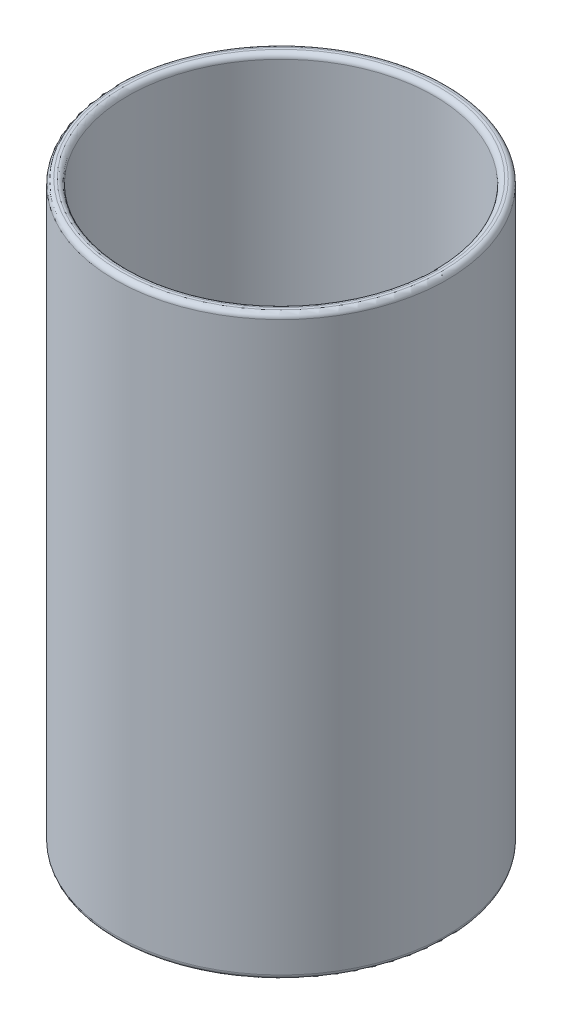
ISO-10303-21;
HEADER;
FILE_DESCRIPTION(('STEP AP214'),'2;1');
FILE_NAME('part.step','',(''),(''),'','','');
FILE_SCHEMA(('AUTOMOTIVE_DESIGN { 1 0 10303 214 1 1 1 1 }'));
ENDSEC;
DATA;
#1=APPLICATION_CONTEXT('core data for automotive mechanical design processes');
#2=APPLICATION_PROTOCOL_DEFINITION('international standard','automotive_design',2000,#1);
#3=PRODUCT_CONTEXT('',#1,'mechanical');
#4=PRODUCT('Part','Part','',(#3));
#5=PRODUCT_RELATED_PRODUCT_CATEGORY('part','',(#4));
#6=PRODUCT_DEFINITION_FORMATION('','',#4);
#7=PRODUCT_DEFINITION_CONTEXT('part definition',#1,'design');
#8=PRODUCT_DEFINITION('design','',#6,#7);
#9=PRODUCT_DEFINITION_SHAPE('','',#8);
#10=(LENGTH_UNIT() NAMED_UNIT(*) SI_UNIT(.MILLI.,.METRE.));
#11=(NAMED_UNIT(*) PLANE_ANGLE_UNIT() SI_UNIT($,.RADIAN.));
#12=(NAMED_UNIT(*) SI_UNIT($,.STERADIAN.) SOLID_ANGLE_UNIT());
#13=UNCERTAINTY_MEASURE_WITH_UNIT(LENGTH_MEASURE(1.E-05),#10,'distance_accuracy_value','');
#14=(GEOMETRIC_REPRESENTATION_CONTEXT(3) GLOBAL_UNCERTAINTY_ASSIGNED_CONTEXT((#13)) GLOBAL_UNIT_ASSIGNED_CONTEXT((#10,
#11,#12)) REPRESENTATION_CONTEXT('',''));
#15=CARTESIAN_POINT('',(0.,0.,0.));
#16=DIRECTION('',(0.,0.,1.));
#17=DIRECTION('',(1.,0.,0.));
#18=AXIS2_PLACEMENT_3D('',#15,#16,#17);
#19=CARTESIAN_POINT('',(0.,115.,0.));
#20=DIRECTION('',(0.,1.,0.));
#21=DIRECTION('',(0.,0.,1.));
#22=AXIS2_PLACEMENT_3D('',#19,#20,#21);
#23=PLANE('',#22);
#24=CARTESIAN_POINT('',(0.,115.,0.));
#25=DIRECTION('',(0.,1.,0.));
#26=DIRECTION('',(0.,0.,1.));
#27=AXIS2_PLACEMENT_3D('',#24,#25,#26);
#28=CIRCLE('',#27,31.5);
#29=CARTESIAN_POINT('',(0.,115.,31.5));
#30=VERTEX_POINT('',#29);
#31=EDGE_CURVE('E10',#30,#30,#28,.F.);
#32=ORIENTED_EDGE('',*,*,#31,.T.);
#33=EDGE_LOOP('',(#32));
#34=FACE_BOUND('',#33,.T.);
#35=CARTESIAN_POINT('',(0.,115.,0.));
#36=DIRECTION('',(0.,1.,0.));
#37=DIRECTION('',(0.,0.,1.));
#38=AXIS2_PLACEMENT_3D('',#35,#36,#37);
#39=CIRCLE('',#38,32.);
#40=CARTESIAN_POINT('',(0.,115.,32.));
#41=VERTEX_POINT('',#40);
#42=EDGE_CURVE('E38',#41,#41,#39,.T.);
#43=ORIENTED_EDGE('',*,*,#42,.T.);
#44=EDGE_LOOP('',(#43));
#45=FACE_BOUND('',#44,.T.);
#46=ADVANCED_FACE('F31',(#34,#45),#23,.T.);
#47=CARTESIAN_POINT('',(0.,0.,0.));
#48=DIRECTION('',(0.,1.,0.));
#49=DIRECTION('',(0.,0.,1.));
#50=AXIS2_PLACEMENT_3D('',#47,#48,#49);
#51=PLANE('',#50);
#52=CARTESIAN_POINT('',(0.,0.,0.));
#53=DIRECTION('',(0.,1.,0.));
#54=DIRECTION('',(0.,0.,1.));
#55=AXIS2_PLACEMENT_3D('',#52,#53,#54);
#56=CIRCLE('',#55,31.5);
#57=CARTESIAN_POINT('',(0.,0.,31.5));
#58=VERTEX_POINT('',#57);
#59=EDGE_CURVE('E57',#58,#58,#56,.T.);
#60=ORIENTED_EDGE('',*,*,#59,.T.);
#61=EDGE_LOOP('',(#60));
#62=FACE_BOUND('',#61,.T.);
#63=CARTESIAN_POINT('',(0.,0.,0.));
#64=DIRECTION('',(0.,1.,0.));
#65=DIRECTION('',(0.,0.,1.));
#66=AXIS2_PLACEMENT_3D('',#63,#64,#65);
#67=CIRCLE('',#66,32.);
#68=CARTESIAN_POINT('',(0.,0.,32.));
#69=VERTEX_POINT('',#68);
#70=EDGE_CURVE('E60',#69,#69,#67,.F.);
#71=ORIENTED_EDGE('',*,*,#70,.T.);
#72=EDGE_LOOP('',(#71));
#73=FACE_BOUND('',#72,.T.);
#74=ADVANCED_FACE('F64',(#62,#73),#51,.F.);
#75=CARTESIAN_POINT('',(0.,115.,0.));
#76=DIRECTION('',(0.,-1.,0.));
#77=DIRECTION('',(0.,0.,-1.));
#78=AXIS2_PLACEMENT_3D('',#75,#76,#77);
#79=CYLINDRICAL_SURFACE('',#78,33.);
#80=CARTESIAN_POINT('',(0.,1.,0.));
#81=DIRECTION('',(0.,1.,0.));
#82=DIRECTION('',(0.,0.,1.));
#83=AXIS2_PLACEMENT_3D('',#80,#81,#82);
#84=CIRCLE('',#83,33.);
#85=CARTESIAN_POINT('',(0.,1.,33.));
#86=VERTEX_POINT('',#85);
#87=EDGE_CURVE('E42',#86,#86,#84,.T.);
#88=ORIENTED_EDGE('',*,*,#87,.T.);
#89=EDGE_LOOP('',(#88));
#90=FACE_BOUND('',#89,.T.);
#91=CARTESIAN_POINT('',(0.,114.,0.));
#92=DIRECTION('',(0.,1.,0.));
#93=DIRECTION('',(0.,0.,1.));
#94=AXIS2_PLACEMENT_3D('',#91,#92,#93);
#95=CIRCLE('',#94,33.);
#96=CARTESIAN_POINT('',(0.,114.,33.));
#97=VERTEX_POINT('',#96);
#98=EDGE_CURVE('E46',#97,#97,#95,.F.);
#99=ORIENTED_EDGE('',*,*,#98,.T.);
#100=EDGE_LOOP('',(#99));
#101=FACE_BOUND('',#100,.T.);
#102=ADVANCED_FACE('F74',(#90,#101),#79,.T.);
#103=CARTESIAN_POINT('',(0.,115.,0.));
#104=DIRECTION('',(0.,-1.,0.));
#105=DIRECTION('',(0.,0.,-1.));
#106=AXIS2_PLACEMENT_3D('',#103,#104,#105);
#107=CYLINDRICAL_SURFACE('',#106,30.5);
#108=CARTESIAN_POINT('',(0.,1.,0.));
#109=DIRECTION('',(0.,1.,0.));
#110=DIRECTION('',(0.,0.,1.));
#111=AXIS2_PLACEMENT_3D('',#108,#109,#110);
#112=CIRCLE('',#111,30.5);
#113=CARTESIAN_POINT('',(0.,1.,30.5));
#114=VERTEX_POINT('',#113);
#115=EDGE_CURVE('E51',#114,#114,#112,.F.);
#116=ORIENTED_EDGE('',*,*,#115,.T.);
#117=EDGE_LOOP('',(#116));
#118=FACE_BOUND('',#117,.T.);
#119=CARTESIAN_POINT('',(0.,114.,0.));
#120=DIRECTION('',(0.,1.,0.));
#121=DIRECTION('',(0.,0.,1.));
#122=AXIS2_PLACEMENT_3D('',#119,#120,#121);
#123=CIRCLE('',#122,30.5);
#124=CARTESIAN_POINT('',(0.,114.,30.5));
#125=VERTEX_POINT('',#124);
#126=EDGE_CURVE('E54',#125,#125,#123,.T.);
#127=ORIENTED_EDGE('',*,*,#126,.T.);
#128=EDGE_LOOP('',(#127));
#129=FACE_BOUND('',#128,.T.);
#130=ADVANCED_FACE('F77',(#118,#129),#107,.F.);
#131=CARTESIAN_POINT('',(0.,1.,0.));
#132=DIRECTION('',(0.,1.,0.));
#133=DIRECTION('',(0.,0.,1.));
#134=AXIS2_PLACEMENT_3D('',#131,#132,#133);
#135=TOROIDAL_SURFACE('',#134,31.5,1.);
#136=ORIENTED_EDGE('',*,*,#115,.F.);
#137=EDGE_LOOP('',(#136));
#138=FACE_BOUND('',#137,.T.);
#139=ORIENTED_EDGE('',*,*,#59,.F.);
#140=EDGE_LOOP('',(#139));
#141=FACE_BOUND('',#140,.T.);
#142=ADVANCED_FACE('F70',(#138,#141),#135,.T.);
#143=CARTESIAN_POINT('',(0.,1.,0.));
#144=DIRECTION('',(0.,1.,0.));
#145=DIRECTION('',(0.,0.,1.));
#146=AXIS2_PLACEMENT_3D('',#143,#144,#145);
#147=TOROIDAL_SURFACE('',#146,32.,1.);
#148=ORIENTED_EDGE('',*,*,#70,.F.);
#149=EDGE_LOOP('',(#148));
#150=FACE_BOUND('',#149,.T.);
#151=ORIENTED_EDGE('',*,*,#87,.F.);
#152=EDGE_LOOP('',(#151));
#153=FACE_BOUND('',#152,.T.);
#154=ADVANCED_FACE('F66',(#150,#153),#147,.T.);
#155=CARTESIAN_POINT('',(0.,114.,0.));
#156=DIRECTION('',(0.,1.,0.));
#157=DIRECTION('',(0.,0.,1.));
#158=AXIS2_PLACEMENT_3D('',#155,#156,#157);
#159=TOROIDAL_SURFACE('',#158,31.5,1.);
#160=ORIENTED_EDGE('',*,*,#31,.F.);
#161=EDGE_LOOP('',(#160));
#162=FACE_BOUND('',#161,.T.);
#163=ORIENTED_EDGE('',*,*,#126,.F.);
#164=EDGE_LOOP('',(#163));
#165=FACE_BOUND('',#164,.T.);
#166=ADVANCED_FACE('F69',(#162,#165),#159,.T.);
#167=CARTESIAN_POINT('',(0.,114.,0.));
#168=DIRECTION('',(0.,1.,0.));
#169=DIRECTION('',(0.,0.,1.));
#170=AXIS2_PLACEMENT_3D('',#167,#168,#169);
#171=TOROIDAL_SURFACE('',#170,32.,1.);
#172=ORIENTED_EDGE('',*,*,#98,.F.);
#173=EDGE_LOOP('',(#172));
#174=FACE_BOUND('',#173,.T.);
#175=ORIENTED_EDGE('',*,*,#42,.F.);
#176=EDGE_LOOP('',(#175));
#177=FACE_BOUND('',#176,.T.);
#178=ADVANCED_FACE('F33',(#174,#177),#171,.T.);
#179=CLOSED_SHELL('',(#46,#74,#102,#130,#142,#154,#166,#178));
#180=MANIFOLD_SOLID_BREP('B2',#179);
#181=ADVANCED_BREP_SHAPE_REPRESENTATION('',(#18,#180),#14);
#182=SHAPE_DEFINITION_REPRESENTATION(#9,#181);
ENDSEC;
END-ISO-10303-21;
